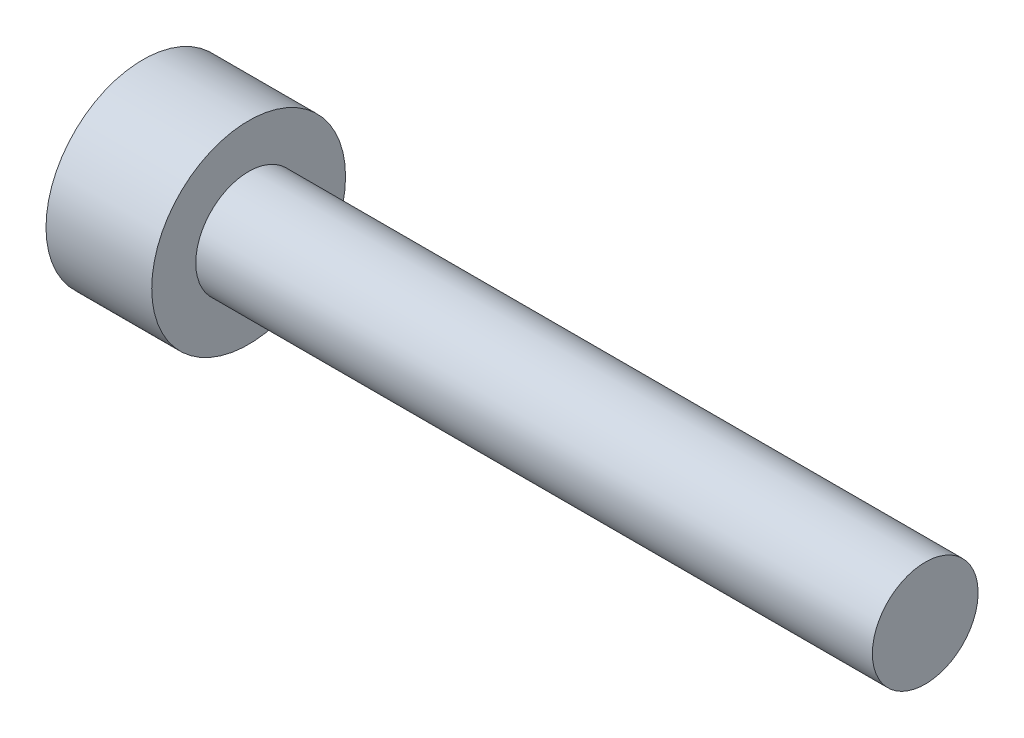
ISO-10303-21;
HEADER;
FILE_DESCRIPTION(('STEP AP214'),'2;1');
FILE_NAME('part.step','',(''),(''),'','','');
FILE_SCHEMA(('AUTOMOTIVE_DESIGN { 1 0 10303 214 1 1 1 1 }'));
ENDSEC;
DATA;
#1=APPLICATION_CONTEXT('core data for automotive mechanical design processes');
#2=APPLICATION_PROTOCOL_DEFINITION('international standard','automotive_design',2000,#1);
#3=PRODUCT_CONTEXT('',#1,'mechanical');
#4=PRODUCT('Part','Part','',(#3));
#5=PRODUCT_RELATED_PRODUCT_CATEGORY('part','',(#4));
#6=PRODUCT_DEFINITION_FORMATION('','',#4);
#7=PRODUCT_DEFINITION_CONTEXT('part definition',#1,'design');
#8=PRODUCT_DEFINITION('design','',#6,#7);
#9=PRODUCT_DEFINITION_SHAPE('','',#8);
#10=(LENGTH_UNIT() NAMED_UNIT(*) SI_UNIT(.MILLI.,.METRE.));
#11=(NAMED_UNIT(*) PLANE_ANGLE_UNIT() SI_UNIT($,.RADIAN.));
#12=(NAMED_UNIT(*) SI_UNIT($,.STERADIAN.) SOLID_ANGLE_UNIT());
#13=UNCERTAINTY_MEASURE_WITH_UNIT(LENGTH_MEASURE(1.E-05),#10,'distance_accuracy_value','');
#14=(GEOMETRIC_REPRESENTATION_CONTEXT(3) GLOBAL_UNCERTAINTY_ASSIGNED_CONTEXT((#13)) GLOBAL_UNIT_ASSIGNED_CONTEXT((#10,
#11,#12)) REPRESENTATION_CONTEXT('',''));
#15=CARTESIAN_POINT('',(0.,0.,0.));
#16=DIRECTION('',(0.,0.,1.));
#17=DIRECTION('',(1.,0.,0.));
#18=AXIS2_PLACEMENT_3D('',#15,#16,#17);
#19=CARTESIAN_POINT('',(131.5,2.75,0.));
#20=DIRECTION('',(1.,0.,0.));
#21=DIRECTION('',(0.,0.,-1.));
#22=AXIS2_PLACEMENT_3D('',#19,#20,#21);
#23=PLANE('',#22);
#24=CARTESIAN_POINT('',(131.5,0.,0.));
#25=DIRECTION('',(-1.,0.,0.));
#26=DIRECTION('',(0.,0.,1.));
#27=AXIS2_PLACEMENT_3D('',#24,#25,#26);
#28=CIRCLE('',#27,2.75);
#29=CARTESIAN_POINT('',(131.5,0.,2.75));
#30=VERTEX_POINT('',#29);
#31=EDGE_CURVE('E45',#30,#30,#28,.T.);
#32=ORIENTED_EDGE('',*,*,#31,.T.);
#33=EDGE_LOOP('',(#32));
#34=FACE_BOUND('',#33,.T.);
#35=ADVANCED_FACE('F31',(#34),#23,.F.);
#36=CARTESIAN_POINT('',(153.7,0.,0.));
#37=DIRECTION('',(-1.,0.,0.));
#38=DIRECTION('',(0.,0.,1.));
#39=AXIS2_PLACEMENT_3D('',#36,#37,#38);
#40=PLANE('',#39);
#41=CARTESIAN_POINT('',(153.7,0.,0.));
#42=DIRECTION('',(-1.,0.,0.));
#43=DIRECTION('',(0.,0.,1.));
#44=AXIS2_PLACEMENT_3D('',#41,#42,#43);
#45=CIRCLE('',#44,1.5);
#46=CARTESIAN_POINT('',(153.7,0.,1.5));
#47=VERTEX_POINT('',#46);
#48=EDGE_CURVE('E10',#47,#47,#45,.T.);
#49=ORIENTED_EDGE('',*,*,#48,.F.);
#50=EDGE_LOOP('',(#49));
#51=FACE_BOUND('',#50,.T.);
#52=ADVANCED_FACE('F65',(#51),#40,.F.);
#53=CARTESIAN_POINT('',(-110.,0.,0.));
#54=DIRECTION('',(-1.,0.,0.));
#55=DIRECTION('',(0.,0.,1.));
#56=AXIS2_PLACEMENT_3D('',#53,#54,#55);
#57=CYLINDRICAL_SURFACE('',#56,1.5);
#58=CARTESIAN_POINT('',(134.5,0.,0.));
#59=DIRECTION('',(-1.,0.,0.));
#60=DIRECTION('',(0.,0.,1.));
#61=AXIS2_PLACEMENT_3D('',#58,#59,#60);
#62=CIRCLE('',#61,1.5);
#63=CARTESIAN_POINT('',(134.5,0.,1.5));
#64=VERTEX_POINT('',#63);
#65=EDGE_CURVE('E37',#64,#64,#62,.T.);
#66=ORIENTED_EDGE('',*,*,#65,.F.);
#67=EDGE_LOOP('',(#66));
#68=FACE_BOUND('',#67,.T.);
#69=ORIENTED_EDGE('',*,*,#48,.T.);
#70=EDGE_LOOP('',(#69));
#71=FACE_BOUND('',#70,.T.);
#72=ADVANCED_FACE('F60',(#68,#71),#57,.T.);
#73=CARTESIAN_POINT('',(134.5,1.5,0.));
#74=DIRECTION('',(-1.,0.,0.));
#75=DIRECTION('',(0.,0.,1.));
#76=AXIS2_PLACEMENT_3D('',#73,#74,#75);
#77=PLANE('',#76);
#78=CARTESIAN_POINT('',(134.5,0.,0.));
#79=DIRECTION('',(-1.,0.,0.));
#80=DIRECTION('',(0.,0.,1.));
#81=AXIS2_PLACEMENT_3D('',#78,#79,#80);
#82=CIRCLE('',#81,2.75);
#83=CARTESIAN_POINT('',(134.5,0.,2.75));
#84=VERTEX_POINT('',#83);
#85=EDGE_CURVE('E41',#84,#84,#82,.T.);
#86=ORIENTED_EDGE('',*,*,#85,.F.);
#87=EDGE_LOOP('',(#86));
#88=FACE_BOUND('',#87,.T.);
#89=ORIENTED_EDGE('',*,*,#65,.T.);
#90=EDGE_LOOP('',(#89));
#91=FACE_BOUND('',#90,.T.);
#92=ADVANCED_FACE('F55',(#88,#91),#77,.F.);
#93=CARTESIAN_POINT('',(-110.,0.,0.));
#94=DIRECTION('',(-1.,0.,0.));
#95=DIRECTION('',(0.,0.,1.));
#96=AXIS2_PLACEMENT_3D('',#93,#94,#95);
#97=CYLINDRICAL_SURFACE('',#96,2.75);
#98=ORIENTED_EDGE('',*,*,#31,.F.);
#99=EDGE_LOOP('',(#98));
#100=FACE_BOUND('',#99,.T.);
#101=ORIENTED_EDGE('',*,*,#85,.T.);
#102=EDGE_LOOP('',(#101));
#103=FACE_BOUND('',#102,.T.);
#104=ADVANCED_FACE('F52',(#100,#103),#97,.T.);
#105=CLOSED_SHELL('',(#35,#52,#72,#92,#104));
#106=MANIFOLD_SOLID_BREP('B2',#105);
#107=ADVANCED_BREP_SHAPE_REPRESENTATION('',(#18,#106),#14);
#108=SHAPE_DEFINITION_REPRESENTATION(#9,#107);
ENDSEC;
END-ISO-10303-21;
